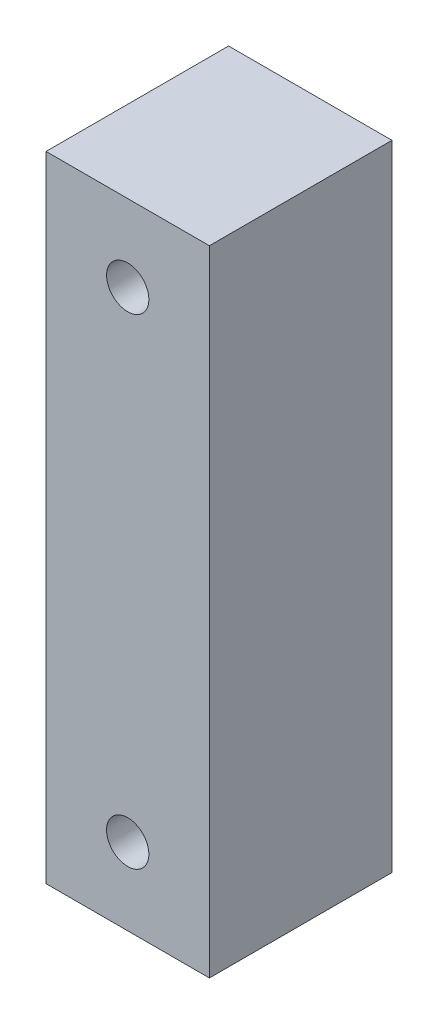
ISO-10303-21;
HEADER;
FILE_DESCRIPTION(('STEP AP214'),'2;1');
FILE_NAME('part.step','',(''),(''),'','','');
FILE_SCHEMA(('AUTOMOTIVE_DESIGN { 1 0 10303 214 1 1 1 1 }'));
ENDSEC;
DATA;
#1=APPLICATION_CONTEXT('core data for automotive mechanical design processes');
#2=APPLICATION_PROTOCOL_DEFINITION('international standard','automotive_design',2000,#1);
#3=PRODUCT_CONTEXT('',#1,'mechanical');
#4=PRODUCT('Part','Part','',(#3));
#5=PRODUCT_RELATED_PRODUCT_CATEGORY('part','',(#4));
#6=PRODUCT_DEFINITION_FORMATION('','',#4);
#7=PRODUCT_DEFINITION_CONTEXT('part definition',#1,'design');
#8=PRODUCT_DEFINITION('design','',#6,#7);
#9=PRODUCT_DEFINITION_SHAPE('','',#8);
#10=(LENGTH_UNIT() NAMED_UNIT(*) SI_UNIT(.MILLI.,.METRE.));
#11=(NAMED_UNIT(*) PLANE_ANGLE_UNIT() SI_UNIT($,.RADIAN.));
#12=(NAMED_UNIT(*) SI_UNIT($,.STERADIAN.) SOLID_ANGLE_UNIT());
#13=UNCERTAINTY_MEASURE_WITH_UNIT(LENGTH_MEASURE(1.E-05),#10,'distance_accuracy_value','');
#14=(GEOMETRIC_REPRESENTATION_CONTEXT(3) GLOBAL_UNCERTAINTY_ASSIGNED_CONTEXT((#13)) GLOBAL_UNIT_ASSIGNED_CONTEXT((#10,
#11,#12)) REPRESENTATION_CONTEXT('',''));
#15=CARTESIAN_POINT('',(0.,0.,0.));
#16=DIRECTION('',(0.,0.,1.));
#17=DIRECTION('',(1.,0.,0.));
#18=AXIS2_PLACEMENT_3D('',#15,#16,#17);
#19=CARTESIAN_POINT('',(85.,165.,-83.5));
#20=DIRECTION('',(0.,-1.,0.));
#21=DIRECTION('',(0.,0.,-1.));
#22=AXIS2_PLACEMENT_3D('',#19,#20,#21);
#23=PLANE('',#22);
#24=DIRECTION('',(0.,0.,1.));
#25=VECTOR('',#24,1.);
#26=CARTESIAN_POINT('',(0.,165.,-83.5));
#27=LINE('',#26,#25);
#28=CARTESIAN_POINT('',(0.,165.,-83.5));
#29=VERTEX_POINT('',#28);
#30=CARTESIAN_POINT('',(0.,165.,11.5));
#31=VERTEX_POINT('',#30);
#32=EDGE_CURVE('E116',#29,#31,#27,.T.);
#33=ORIENTED_EDGE('',*,*,#32,.T.);
#34=DIRECTION('',(-1.,0.,0.));
#35=VECTOR('',#34,1.);
#36=CARTESIAN_POINT('',(85.,165.,11.5));
#37=LINE('',#36,#35);
#38=CARTESIAN_POINT('',(85.,165.,11.5));
#39=VERTEX_POINT('',#38);
#40=EDGE_CURVE('E11',#39,#31,#37,.T.);
#41=ORIENTED_EDGE('',*,*,#40,.F.);
#42=DIRECTION('',(0.,0.,1.));
#43=VECTOR('',#42,1.);
#44=CARTESIAN_POINT('',(85.,165.,-83.5));
#45=LINE('',#44,#43);
#46=CARTESIAN_POINT('',(85.,165.,-83.5));
#47=VERTEX_POINT('',#46);
#48=EDGE_CURVE('E99',#47,#39,#45,.T.);
#49=ORIENTED_EDGE('',*,*,#48,.F.);
#50=DIRECTION('',(-1.,0.,0.));
#51=VECTOR('',#50,1.);
#52=CARTESIAN_POINT('',(85.,165.,-83.5));
#53=LINE('',#52,#51);
#54=EDGE_CURVE('E112',#47,#29,#53,.T.);
#55=ORIENTED_EDGE('',*,*,#54,.T.);
#56=EDGE_LOOP('',(#33,#41,#49,#55));
#57=FACE_BOUND('',#56,.T.);
#58=ADVANCED_FACE('F45',(#57),#23,.F.);
#59=CARTESIAN_POINT('',(85.,-165.,11.5));
#60=DIRECTION('',(0.,0.,-1.));
#61=DIRECTION('',(-1.,0.,0.));
#62=AXIS2_PLACEMENT_3D('',#59,#60,#61);
#63=PLANE('',#62);
#64=CARTESIAN_POINT('',(42.5,125.,11.5));
#65=DIRECTION('',(0.,0.,1.));
#66=DIRECTION('',(1.,0.,0.));
#67=AXIS2_PLACEMENT_3D('',#64,#65,#66);
#68=CIRCLE('',#67,11.);
#69=CARTESIAN_POINT('',(53.5,125.,11.5));
#70=VERTEX_POINT('',#69);
#71=EDGE_CURVE('E132',#70,#70,#68,.T.);
#72=ORIENTED_EDGE('',*,*,#71,.F.);
#73=EDGE_LOOP('',(#72));
#74=FACE_BOUND('',#73,.T.);
#75=CARTESIAN_POINT('',(42.5,-125.,11.5));
#76=DIRECTION('',(0.,0.,1.));
#77=DIRECTION('',(-1.,0.,0.));
#78=AXIS2_PLACEMENT_3D('',#75,#76,#77);
#79=CIRCLE('',#78,11.);
#80=CARTESIAN_POINT('',(31.5,-125.,11.5));
#81=VERTEX_POINT('',#80);
#82=EDGE_CURVE('E139',#81,#81,#79,.T.);
#83=ORIENTED_EDGE('',*,*,#82,.F.);
#84=EDGE_LOOP('',(#83));
#85=FACE_BOUND('',#84,.T.);
#86=DIRECTION('',(0.,-1.,0.));
#87=VECTOR('',#86,1.);
#88=CARTESIAN_POINT('',(0.,-165.,11.5));
#89=LINE('',#88,#87);
#90=CARTESIAN_POINT('',(0.,-165.,11.5));
#91=VERTEX_POINT('',#90);
#92=EDGE_CURVE('E104',#31,#91,#89,.T.);
#93=ORIENTED_EDGE('',*,*,#92,.T.);
#94=DIRECTION('',(-1.,0.,0.));
#95=VECTOR('',#94,1.);
#96=CARTESIAN_POINT('',(85.,-165.,11.5));
#97=LINE('',#96,#95);
#98=CARTESIAN_POINT('',(85.,-165.,11.5));
#99=VERTEX_POINT('',#98);
#100=EDGE_CURVE('E55',#99,#91,#97,.T.);
#101=ORIENTED_EDGE('',*,*,#100,.F.);
#102=DIRECTION('',(0.,-1.,0.));
#103=VECTOR('',#102,1.);
#104=CARTESIAN_POINT('',(85.,-165.,11.5));
#105=LINE('',#104,#103);
#106=EDGE_CURVE('E94',#39,#99,#105,.T.);
#107=ORIENTED_EDGE('',*,*,#106,.F.);
#108=ORIENTED_EDGE('',*,*,#40,.T.);
#109=EDGE_LOOP('',(#93,#101,#107,#108));
#110=FACE_BOUND('',#109,.T.);
#111=ADVANCED_FACE('F103',(#74,#85,#110),#63,.F.);
#112=CARTESIAN_POINT('',(85.,-165.,-83.4999999999999));
#113=DIRECTION('',(0.,1.,0.));
#114=DIRECTION('',(0.,0.,1.));
#115=AXIS2_PLACEMENT_3D('',#112,#113,#114);
#116=PLANE('',#115);
#117=DIRECTION('',(0.,0.,-1.));
#118=VECTOR('',#117,1.);
#119=CARTESIAN_POINT('',(0.,-165.,-83.4999999999999));
#120=LINE('',#119,#118);
#121=CARTESIAN_POINT('',(0.,-165.,-83.4999999999999));
#122=VERTEX_POINT('',#121);
#123=EDGE_CURVE('E81',#91,#122,#120,.T.);
#124=ORIENTED_EDGE('',*,*,#123,.T.);
#125=DIRECTION('',(-1.,0.,0.));
#126=VECTOR('',#125,1.);
#127=CARTESIAN_POINT('',(85.,-165.,-83.4999999999999));
#128=LINE('',#127,#126);
#129=CARTESIAN_POINT('',(85.,-165.,-83.4999999999999));
#130=VERTEX_POINT('',#129);
#131=EDGE_CURVE('E106',#130,#122,#128,.T.);
#132=ORIENTED_EDGE('',*,*,#131,.F.);
#133=DIRECTION('',(0.,0.,-1.));
#134=VECTOR('',#133,1.);
#135=CARTESIAN_POINT('',(85.,-165.,-83.4999999999999));
#136=LINE('',#135,#134);
#137=EDGE_CURVE('E97',#99,#130,#136,.T.);
#138=ORIENTED_EDGE('',*,*,#137,.F.);
#139=ORIENTED_EDGE('',*,*,#100,.T.);
#140=EDGE_LOOP('',(#124,#132,#138,#139));
#141=FACE_BOUND('',#140,.T.);
#142=ADVANCED_FACE('F108',(#141),#116,.F.);
#143=CARTESIAN_POINT('',(85.,-165.,-83.4999999999999));
#144=DIRECTION('',(0.,0.,1.));
#145=DIRECTION('',(0.,-1.,0.));
#146=AXIS2_PLACEMENT_3D('',#143,#144,#145);
#147=PLANE('',#146);
#148=CARTESIAN_POINT('',(42.5,125.,-83.5));
#149=DIRECTION('',(0.,0.,1.));
#150=DIRECTION('',(0.,-1.,0.));
#151=AXIS2_PLACEMENT_3D('',#148,#149,#150);
#152=CIRCLE('',#151,11.);
#153=CARTESIAN_POINT('',(42.5,114.,-83.5));
#154=VERTEX_POINT('',#153);
#155=EDGE_CURVE('E48',#154,#154,#152,.T.);
#156=ORIENTED_EDGE('',*,*,#155,.T.);
#157=EDGE_LOOP('',(#156));
#158=FACE_BOUND('',#157,.T.);
#159=CARTESIAN_POINT('',(42.5,-125.,-83.5));
#160=DIRECTION('',(0.,0.,1.));
#161=DIRECTION('',(0.,-1.,0.));
#162=AXIS2_PLACEMENT_3D('',#159,#160,#161);
#163=CIRCLE('',#162,11.);
#164=CARTESIAN_POINT('',(42.5,-136.,-83.5));
#165=VERTEX_POINT('',#164);
#166=EDGE_CURVE('E129',#165,#165,#163,.T.);
#167=ORIENTED_EDGE('',*,*,#166,.T.);
#168=EDGE_LOOP('',(#167));
#169=FACE_BOUND('',#168,.T.);
#170=DIRECTION('',(0.,1.,0.));
#171=VECTOR('',#170,1.);
#172=CARTESIAN_POINT('',(0.,-165.,-83.4999999999999));
#173=LINE('',#172,#171);
#174=EDGE_CURVE('E87',#122,#29,#173,.T.);
#175=ORIENTED_EDGE('',*,*,#174,.T.);
#176=ORIENTED_EDGE('',*,*,#54,.F.);
#177=DIRECTION('',(0.,1.,0.));
#178=VECTOR('',#177,1.);
#179=CARTESIAN_POINT('',(85.,-165.,-83.4999999999999));
#180=LINE('',#179,#178);
#181=EDGE_CURVE('E64',#130,#47,#180,.T.);
#182=ORIENTED_EDGE('',*,*,#181,.F.);
#183=ORIENTED_EDGE('',*,*,#131,.T.);
#184=EDGE_LOOP('',(#175,#176,#182,#183));
#185=FACE_BOUND('',#184,.T.);
#186=ADVANCED_FACE('F159',(#158,#169,#185),#147,.F.);
#187=CARTESIAN_POINT('',(85.,0.,0.));
#188=DIRECTION('',(-1.,0.,0.));
#189=DIRECTION('',(0.,0.,1.));
#190=AXIS2_PLACEMENT_3D('',#187,#188,#189);
#191=PLANE('',#190);
#192=ORIENTED_EDGE('',*,*,#48,.T.);
#193=ORIENTED_EDGE('',*,*,#106,.T.);
#194=ORIENTED_EDGE('',*,*,#137,.T.);
#195=ORIENTED_EDGE('',*,*,#181,.T.);
#196=EDGE_LOOP('',(#192,#193,#194,#195));
#197=FACE_BOUND('',#196,.T.);
#198=ADVANCED_FACE('F95',(#197),#191,.F.);
#199=CARTESIAN_POINT('',(0.,0.,0.));
#200=DIRECTION('',(-1.,0.,0.));
#201=DIRECTION('',(0.,0.,1.));
#202=AXIS2_PLACEMENT_3D('',#199,#200,#201);
#203=PLANE('',#202);
#204=ORIENTED_EDGE('',*,*,#32,.F.);
#205=ORIENTED_EDGE('',*,*,#174,.F.);
#206=ORIENTED_EDGE('',*,*,#123,.F.);
#207=ORIENTED_EDGE('',*,*,#92,.F.);
#208=EDGE_LOOP('',(#204,#205,#206,#207));
#209=FACE_BOUND('',#208,.T.);
#210=ADVANCED_FACE('F166',(#209),#203,.T.);
#211=CARTESIAN_POINT('',(42.5,-125.,-138.5));
#212=DIRECTION('',(0.,0.,1.));
#213=DIRECTION('',(1.,0.,0.));
#214=AXIS2_PLACEMENT_3D('',#211,#212,#213);
#215=CYLINDRICAL_SURFACE('',#214,11.);
#216=ORIENTED_EDGE('',*,*,#82,.T.);
#217=EDGE_LOOP('',(#216));
#218=FACE_BOUND('',#217,.T.);
#219=ORIENTED_EDGE('',*,*,#166,.F.);
#220=EDGE_LOOP('',(#219));
#221=FACE_BOUND('',#220,.T.);
#222=ADVANCED_FACE('F149',(#218,#221),#215,.F.);
#223=CARTESIAN_POINT('',(42.5,125.,-138.5));
#224=DIRECTION('',(0.,0.,1.));
#225=DIRECTION('',(1.,0.,0.));
#226=AXIS2_PLACEMENT_3D('',#223,#224,#225);
#227=CYLINDRICAL_SURFACE('',#226,11.);
#228=ORIENTED_EDGE('',*,*,#71,.T.);
#229=EDGE_LOOP('',(#228));
#230=FACE_BOUND('',#229,.T.);
#231=ORIENTED_EDGE('',*,*,#155,.F.);
#232=EDGE_LOOP('',(#231));
#233=FACE_BOUND('',#232,.T.);
#234=ADVANCED_FACE('F173',(#230,#233),#227,.F.);
#235=CLOSED_SHELL('',(#58,#111,#142,#186,#198,#210,#222,#234));
#236=MANIFOLD_SOLID_BREP('B2',#235);
#237=ADVANCED_BREP_SHAPE_REPRESENTATION('',(#18,#236),#14);
#238=SHAPE_DEFINITION_REPRESENTATION(#9,#237);
ENDSEC;
END-ISO-10303-21;
